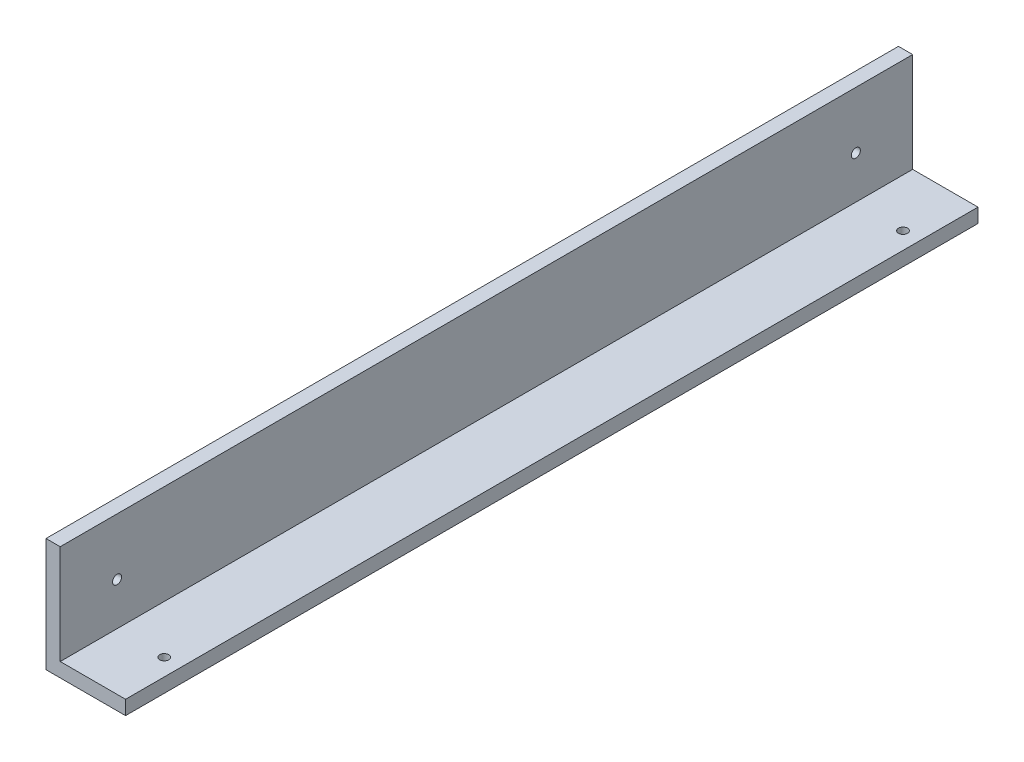
ISO-10303-21;
HEADER;
FILE_DESCRIPTION(('STEP AP214'),'2;1');
FILE_NAME('part.step','',(''),(''),'','','');
FILE_SCHEMA(('AUTOMOTIVE_DESIGN { 1 0 10303 214 1 1 1 1 }'));
ENDSEC;
DATA;
#1=APPLICATION_CONTEXT('core data for automotive mechanical design processes');
#2=APPLICATION_PROTOCOL_DEFINITION('international standard','automotive_design',2000,#1);
#3=PRODUCT_CONTEXT('',#1,'mechanical');
#4=PRODUCT('Part','Part','',(#3));
#5=PRODUCT_RELATED_PRODUCT_CATEGORY('part','',(#4));
#6=PRODUCT_DEFINITION_FORMATION('','',#4);
#7=PRODUCT_DEFINITION_CONTEXT('part definition',#1,'design');
#8=PRODUCT_DEFINITION('design','',#6,#7);
#9=PRODUCT_DEFINITION_SHAPE('','',#8);
#10=(LENGTH_UNIT() NAMED_UNIT(*) SI_UNIT(.MILLI.,.METRE.));
#11=(NAMED_UNIT(*) PLANE_ANGLE_UNIT() SI_UNIT($,.RADIAN.));
#12=(NAMED_UNIT(*) SI_UNIT($,.STERADIAN.) SOLID_ANGLE_UNIT());
#13=UNCERTAINTY_MEASURE_WITH_UNIT(LENGTH_MEASURE(1.E-05),#10,'distance_accuracy_value','');
#14=(GEOMETRIC_REPRESENTATION_CONTEXT(3) GLOBAL_UNCERTAINTY_ASSIGNED_CONTEXT((#13)) GLOBAL_UNIT_ASSIGNED_CONTEXT((#10,
#11,#12)) REPRESENTATION_CONTEXT('',''));
#15=CARTESIAN_POINT('',(0.,0.,0.));
#16=DIRECTION('',(0.,0.,1.));
#17=DIRECTION('',(1.,0.,0.));
#18=AXIS2_PLACEMENT_3D('',#15,#16,#17);
#19=CARTESIAN_POINT('',(0.,0.,381.));
#20=DIRECTION('',(0.,1.,0.));
#21=DIRECTION('',(0.,0.,1.));
#22=AXIS2_PLACEMENT_3D('',#19,#20,#21);
#23=PLANE('',#22);
#24=CARTESIAN_POINT('',(27.9399999999999,0.,356.095307591426));
#25=DIRECTION('',(0.,1.,0.));
#26=DIRECTION('',(0.,0.,1.));
#27=AXIS2_PLACEMENT_3D('',#24,#25,#26);
#28=CIRCLE('',#27,2.0193);
#29=CARTESIAN_POINT('',(27.9399999999999,0.,358.114607591426));
#30=VERTEX_POINT('',#29);
#31=EDGE_CURVE('E165',#30,#30,#28,.T.);
#32=ORIENTED_EDGE('',*,*,#31,.T.);
#33=EDGE_LOOP('',(#32));
#34=FACE_BOUND('',#33,.T.);
#35=CARTESIAN_POINT('',(27.94,0.,25.8953075914262));
#36=DIRECTION('',(0.,1.,0.));
#37=DIRECTION('',(0.,0.,1.));
#38=AXIS2_PLACEMENT_3D('',#35,#36,#37);
#39=CIRCLE('',#38,2.0193);
#40=CARTESIAN_POINT('',(27.94,0.,27.9146075914262));
#41=VERTEX_POINT('',#40);
#42=EDGE_CURVE('E168',#41,#41,#39,.T.);
#43=ORIENTED_EDGE('',*,*,#42,.T.);
#44=EDGE_LOOP('',(#43));
#45=FACE_BOUND('',#44,.T.);
#46=DIRECTION('',(1.,0.,0.));
#47=VECTOR('',#46,1.);
#48=CARTESIAN_POINT('',(0.,0.,0.));
#49=LINE('',#48,#47);
#50=CARTESIAN_POINT('',(0.,0.,0.));
#51=VERTEX_POINT('',#50);
#52=CARTESIAN_POINT('',(35.56,0.,0.));
#53=VERTEX_POINT('',#52);
#54=EDGE_CURVE('E119',#51,#53,#49,.T.);
#55=ORIENTED_EDGE('',*,*,#54,.T.);
#56=DIRECTION('',(0.,0.,-1.));
#57=VECTOR('',#56,1.);
#58=CARTESIAN_POINT('',(35.56,0.,381.));
#59=LINE('',#58,#57);
#60=CARTESIAN_POINT('',(35.56,0.,381.));
#61=VERTEX_POINT('',#60);
#62=EDGE_CURVE('E11',#61,#53,#59,.T.);
#63=ORIENTED_EDGE('',*,*,#62,.F.);
#64=DIRECTION('',(1.,0.,0.));
#65=VECTOR('',#64,1.);
#66=CARTESIAN_POINT('',(0.,0.,381.));
#67=LINE('',#66,#65);
#68=CARTESIAN_POINT('',(0.,0.,381.));
#69=VERTEX_POINT('',#68);
#70=EDGE_CURVE('E130',#69,#61,#67,.T.);
#71=ORIENTED_EDGE('',*,*,#70,.F.);
#72=DIRECTION('',(0.,0.,-1.));
#73=VECTOR('',#72,1.);
#74=CARTESIAN_POINT('',(0.,0.,381.));
#75=LINE('',#74,#73);
#76=EDGE_CURVE('E115',#69,#51,#75,.T.);
#77=ORIENTED_EDGE('',*,*,#76,.T.);
#78=EDGE_LOOP('',(#55,#63,#71,#77));
#79=FACE_BOUND('',#78,.T.);
#80=ADVANCED_FACE('F35',(#34,#45,#79),#23,.F.);
#81=CARTESIAN_POINT('',(35.56,0.,381.));
#82=DIRECTION('',(-1.,0.,0.));
#83=DIRECTION('',(0.,0.,1.));
#84=AXIS2_PLACEMENT_3D('',#81,#82,#83);
#85=PLANE('',#84);
#86=DIRECTION('',(0.,1.,0.));
#87=VECTOR('',#86,1.);
#88=CARTESIAN_POINT('',(35.56,0.,0.));
#89=LINE('',#88,#87);
#90=CARTESIAN_POINT('',(35.56,6.35,0.));
#91=VERTEX_POINT('',#90);
#92=EDGE_CURVE('E122',#53,#91,#89,.T.);
#93=ORIENTED_EDGE('',*,*,#92,.T.);
#94=DIRECTION('',(0.,0.,-1.));
#95=VECTOR('',#94,1.);
#96=CARTESIAN_POINT('',(35.56,6.35,381.));
#97=LINE('',#96,#95);
#98=CARTESIAN_POINT('',(35.56,6.35,381.));
#99=VERTEX_POINT('',#98);
#100=EDGE_CURVE('E43',#99,#91,#97,.T.);
#101=ORIENTED_EDGE('',*,*,#100,.F.);
#102=DIRECTION('',(0.,1.,0.));
#103=VECTOR('',#102,1.);
#104=CARTESIAN_POINT('',(35.56,0.,381.));
#105=LINE('',#104,#103);
#106=EDGE_CURVE('E88',#61,#99,#105,.T.);
#107=ORIENTED_EDGE('',*,*,#106,.F.);
#108=ORIENTED_EDGE('',*,*,#62,.T.);
#109=EDGE_LOOP('',(#93,#101,#107,#108));
#110=FACE_BOUND('',#109,.T.);
#111=ADVANCED_FACE('F157',(#110),#85,.F.);
#112=CARTESIAN_POINT('',(6.35,6.35,381.));
#113=DIRECTION('',(0.,-1.,0.));
#114=DIRECTION('',(0.,0.,-1.));
#115=AXIS2_PLACEMENT_3D('',#112,#113,#114);
#116=PLANE('',#115);
#117=CARTESIAN_POINT('',(27.9399999999999,6.35,356.095307591426));
#118=DIRECTION('',(0.,1.,0.));
#119=DIRECTION('',(0.,0.,1.));
#120=AXIS2_PLACEMENT_3D('',#117,#118,#119);
#121=CIRCLE('',#120,2.01929999999999);
#122=CARTESIAN_POINT('',(27.9399999999999,6.35,358.114607591426));
#123=VERTEX_POINT('',#122);
#124=EDGE_CURVE('E295',#123,#123,#121,.T.);
#125=ORIENTED_EDGE('',*,*,#124,.F.);
#126=EDGE_LOOP('',(#125));
#127=FACE_BOUND('',#126,.T.);
#128=CARTESIAN_POINT('',(27.94,6.35,25.8953075914262));
#129=DIRECTION('',(0.,1.,0.));
#130=DIRECTION('',(0.,0.,1.));
#131=AXIS2_PLACEMENT_3D('',#128,#129,#130);
#132=CIRCLE('',#131,2.01929999999999);
#133=CARTESIAN_POINT('',(27.94,6.35,27.9146075914262));
#134=VERTEX_POINT('',#133);
#135=EDGE_CURVE('E171',#134,#134,#132,.T.);
#136=ORIENTED_EDGE('',*,*,#135,.F.);
#137=EDGE_LOOP('',(#136));
#138=FACE_BOUND('',#137,.T.);
#139=DIRECTION('',(-1.,0.,0.));
#140=VECTOR('',#139,1.);
#141=CARTESIAN_POINT('',(6.35,6.35,0.));
#142=LINE('',#141,#140);
#143=CARTESIAN_POINT('',(6.35,6.35,0.));
#144=VERTEX_POINT('',#143);
#145=EDGE_CURVE('E125',#91,#144,#142,.T.);
#146=ORIENTED_EDGE('',*,*,#145,.T.);
#147=DIRECTION('',(0.,0.,-1.));
#148=VECTOR('',#147,1.);
#149=CARTESIAN_POINT('',(6.35,6.35,381.));
#150=LINE('',#149,#148);
#151=CARTESIAN_POINT('',(6.35,6.35,381.));
#152=VERTEX_POINT('',#151);
#153=EDGE_CURVE('E110',#152,#144,#150,.T.);
#154=ORIENTED_EDGE('',*,*,#153,.F.);
#155=DIRECTION('',(-1.,0.,0.));
#156=VECTOR('',#155,1.);
#157=CARTESIAN_POINT('',(6.35,6.35,381.));
#158=LINE('',#157,#156);
#159=EDGE_CURVE('E101',#99,#152,#158,.T.);
#160=ORIENTED_EDGE('',*,*,#159,.F.);
#161=ORIENTED_EDGE('',*,*,#100,.T.);
#162=EDGE_LOOP('',(#146,#154,#160,#161));
#163=FACE_BOUND('',#162,.T.);
#164=ADVANCED_FACE('F136',(#127,#138,#163),#116,.F.);
#165=CARTESIAN_POINT('',(6.35,50.8,381.));
#166=DIRECTION('',(-1.,0.,0.));
#167=DIRECTION('',(0.,0.,1.));
#168=AXIS2_PLACEMENT_3D('',#165,#166,#167);
#169=PLANE('',#168);
#170=CARTESIAN_POINT('',(6.35,25.399999999999,355.600000000001));
#171=DIRECTION('',(1.,0.,0.));
#172=DIRECTION('',(0.,0.,-1.));
#173=AXIS2_PLACEMENT_3D('',#170,#171,#172);
#174=CIRCLE('',#173,2.01929999999999);
#175=CARTESIAN_POINT('',(6.35,25.399999999999,353.580700000001));
#176=VERTEX_POINT('',#175);
#177=EDGE_CURVE('E170',#176,#176,#174,.T.);
#178=ORIENTED_EDGE('',*,*,#177,.F.);
#179=EDGE_LOOP('',(#178));
#180=FACE_BOUND('',#179,.T.);
#181=CARTESIAN_POINT('',(6.35,25.4000000000003,25.4000000000004));
#182=DIRECTION('',(1.,0.,0.));
#183=DIRECTION('',(0.,0.,-1.));
#184=AXIS2_PLACEMENT_3D('',#181,#182,#183);
#185=CIRCLE('',#184,2.01929999999999);
#186=CARTESIAN_POINT('',(6.35,25.4000000000003,23.3807000000004));
#187=VERTEX_POINT('',#186);
#188=EDGE_CURVE('E181',#187,#187,#185,.T.);
#189=ORIENTED_EDGE('',*,*,#188,.F.);
#190=EDGE_LOOP('',(#189));
#191=FACE_BOUND('',#190,.T.);
#192=DIRECTION('',(0.,1.,0.));
#193=VECTOR('',#192,1.);
#194=CARTESIAN_POINT('',(6.35,50.8,0.));
#195=LINE('',#194,#193);
#196=CARTESIAN_POINT('',(6.35,50.8,0.));
#197=VERTEX_POINT('',#196);
#198=EDGE_CURVE('E109',#144,#197,#195,.T.);
#199=ORIENTED_EDGE('',*,*,#198,.T.);
#200=DIRECTION('',(0.,0.,-1.));
#201=VECTOR('',#200,1.);
#202=CARTESIAN_POINT('',(6.35,50.8,381.));
#203=LINE('',#202,#201);
#204=CARTESIAN_POINT('',(6.35,50.8,381.));
#205=VERTEX_POINT('',#204);
#206=EDGE_CURVE('E106',#205,#197,#203,.T.);
#207=ORIENTED_EDGE('',*,*,#206,.F.);
#208=DIRECTION('',(0.,1.,0.));
#209=VECTOR('',#208,1.);
#210=CARTESIAN_POINT('',(6.35,50.8,381.));
#211=LINE('',#210,#209);
#212=EDGE_CURVE('E95',#152,#205,#211,.T.);
#213=ORIENTED_EDGE('',*,*,#212,.F.);
#214=ORIENTED_EDGE('',*,*,#153,.T.);
#215=EDGE_LOOP('',(#199,#207,#213,#214));
#216=FACE_BOUND('',#215,.T.);
#217=ADVANCED_FACE('F107',(#180,#191,#216),#169,.F.);
#218=CARTESIAN_POINT('',(0.,50.8,381.));
#219=DIRECTION('',(0.,-1.,0.));
#220=DIRECTION('',(0.,0.,-1.));
#221=AXIS2_PLACEMENT_3D('',#218,#219,#220);
#222=PLANE('',#221);
#223=DIRECTION('',(-1.,0.,0.));
#224=VECTOR('',#223,1.);
#225=CARTESIAN_POINT('',(0.,50.8,0.));
#226=LINE('',#225,#224);
#227=CARTESIAN_POINT('',(0.,50.8,0.));
#228=VERTEX_POINT('',#227);
#229=EDGE_CURVE('E74',#197,#228,#226,.T.);
#230=ORIENTED_EDGE('',*,*,#229,.T.);
#231=DIRECTION('',(0.,0.,-1.));
#232=VECTOR('',#231,1.);
#233=CARTESIAN_POINT('',(0.,50.8,381.));
#234=LINE('',#233,#232);
#235=CARTESIAN_POINT('',(0.,50.8,381.));
#236=VERTEX_POINT('',#235);
#237=EDGE_CURVE('E111',#236,#228,#234,.T.);
#238=ORIENTED_EDGE('',*,*,#237,.F.);
#239=DIRECTION('',(-1.,0.,0.));
#240=VECTOR('',#239,1.);
#241=CARTESIAN_POINT('',(0.,50.8,381.));
#242=LINE('',#241,#240);
#243=EDGE_CURVE('E99',#205,#236,#242,.T.);
#244=ORIENTED_EDGE('',*,*,#243,.F.);
#245=ORIENTED_EDGE('',*,*,#206,.T.);
#246=EDGE_LOOP('',(#230,#238,#244,#245));
#247=FACE_BOUND('',#246,.T.);
#248=ADVANCED_FACE('F113',(#247),#222,.F.);
#249=CARTESIAN_POINT('',(0.,0.,381.));
#250=DIRECTION('',(1.,0.,0.));
#251=DIRECTION('',(0.,0.,-1.));
#252=AXIS2_PLACEMENT_3D('',#249,#250,#251);
#253=PLANE('',#252);
#254=CARTESIAN_POINT('',(0.,25.399999999999,355.600000000001));
#255=DIRECTION('',(1.,0.,0.));
#256=DIRECTION('',(0.,0.,-1.));
#257=AXIS2_PLACEMENT_3D('',#254,#255,#256);
#258=CIRCLE('',#257,2.0193);
#259=CARTESIAN_POINT('',(0.,25.399999999999,353.580700000001));
#260=VERTEX_POINT('',#259);
#261=EDGE_CURVE('E174',#260,#260,#258,.T.);
#262=ORIENTED_EDGE('',*,*,#261,.T.);
#263=EDGE_LOOP('',(#262));
#264=FACE_BOUND('',#263,.T.);
#265=CARTESIAN_POINT('',(0.,25.4000000000003,25.4000000000004));
#266=DIRECTION('',(1.,0.,0.));
#267=DIRECTION('',(0.,0.,-1.));
#268=AXIS2_PLACEMENT_3D('',#265,#266,#267);
#269=CIRCLE('',#268,2.0193);
#270=CARTESIAN_POINT('',(0.,25.4000000000003,23.3807000000004));
#271=VERTEX_POINT('',#270);
#272=EDGE_CURVE('E123',#271,#271,#269,.T.);
#273=ORIENTED_EDGE('',*,*,#272,.T.);
#274=EDGE_LOOP('',(#273));
#275=FACE_BOUND('',#274,.T.);
#276=DIRECTION('',(0.,-1.,0.));
#277=VECTOR('',#276,1.);
#278=CARTESIAN_POINT('',(0.,0.,0.));
#279=LINE('',#278,#277);
#280=EDGE_CURVE('E80',#228,#51,#279,.T.);
#281=ORIENTED_EDGE('',*,*,#280,.T.);
#282=ORIENTED_EDGE('',*,*,#76,.F.);
#283=DIRECTION('',(0.,-1.,0.));
#284=VECTOR('',#283,1.);
#285=CARTESIAN_POINT('',(0.,0.,381.));
#286=LINE('',#285,#284);
#287=EDGE_CURVE('E51',#236,#69,#286,.T.);
#288=ORIENTED_EDGE('',*,*,#287,.F.);
#289=ORIENTED_EDGE('',*,*,#237,.T.);
#290=EDGE_LOOP('',(#281,#282,#288,#289));
#291=FACE_BOUND('',#290,.T.);
#292=ADVANCED_FACE('F143',(#264,#275,#291),#253,.F.);
#293=CARTESIAN_POINT('',(35.56,0.,381.));
#294=DIRECTION('',(0.,0.,1.));
#295=DIRECTION('',(1.,0.,0.));
#296=AXIS2_PLACEMENT_3D('',#293,#294,#295);
#297=PLANE('',#296);
#298=ORIENTED_EDGE('',*,*,#70,.T.);
#299=ORIENTED_EDGE('',*,*,#106,.T.);
#300=ORIENTED_EDGE('',*,*,#159,.T.);
#301=ORIENTED_EDGE('',*,*,#212,.T.);
#302=ORIENTED_EDGE('',*,*,#243,.T.);
#303=ORIENTED_EDGE('',*,*,#287,.T.);
#304=EDGE_LOOP('',(#298,#299,#300,#301,#302,#303));
#305=FACE_BOUND('',#304,.T.);
#306=ADVANCED_FACE('F97',(#305),#297,.T.);
#307=CARTESIAN_POINT('',(35.56,0.,0.));
#308=DIRECTION('',(0.,0.,1.));
#309=DIRECTION('',(1.,0.,0.));
#310=AXIS2_PLACEMENT_3D('',#307,#308,#309);
#311=PLANE('',#310);
#312=ORIENTED_EDGE('',*,*,#54,.F.);
#313=ORIENTED_EDGE('',*,*,#280,.F.);
#314=ORIENTED_EDGE('',*,*,#229,.F.);
#315=ORIENTED_EDGE('',*,*,#198,.F.);
#316=ORIENTED_EDGE('',*,*,#145,.F.);
#317=ORIENTED_EDGE('',*,*,#92,.F.);
#318=EDGE_LOOP('',(#312,#313,#314,#315,#316,#317));
#319=FACE_BOUND('',#318,.T.);
#320=ADVANCED_FACE('F139',(#319),#311,.F.);
#321=CARTESIAN_POINT('',(6.35,25.4000000000003,25.4000000000004));
#322=DIRECTION('',(1.,0.,0.));
#323=DIRECTION('',(0.,0.,-1.));
#324=AXIS2_PLACEMENT_3D('',#321,#322,#323);
#325=CYLINDRICAL_SURFACE('',#324,2.01929999999999);
#326=ORIENTED_EDGE('',*,*,#272,.F.);
#327=EDGE_LOOP('',(#326));
#328=FACE_BOUND('',#327,.T.);
#329=ORIENTED_EDGE('',*,*,#188,.T.);
#330=EDGE_LOOP('',(#329));
#331=FACE_BOUND('',#330,.T.);
#332=ADVANCED_FACE('F189',(#328,#331),#325,.F.);
#333=CARTESIAN_POINT('',(6.35,25.399999999999,355.600000000001));
#334=DIRECTION('',(1.,0.,0.));
#335=DIRECTION('',(0.,0.,-1.));
#336=AXIS2_PLACEMENT_3D('',#333,#334,#335);
#337=CYLINDRICAL_SURFACE('',#336,2.01929999999999);
#338=ORIENTED_EDGE('',*,*,#261,.F.);
#339=EDGE_LOOP('',(#338));
#340=FACE_BOUND('',#339,.T.);
#341=ORIENTED_EDGE('',*,*,#177,.T.);
#342=EDGE_LOOP('',(#341));
#343=FACE_BOUND('',#342,.T.);
#344=ADVANCED_FACE('F192',(#340,#343),#337,.F.);
#345=CARTESIAN_POINT('',(27.94,6.35,25.8953075914262));
#346=DIRECTION('',(0.,1.,0.));
#347=DIRECTION('',(0.,0.,1.));
#348=AXIS2_PLACEMENT_3D('',#345,#346,#347);
#349=CYLINDRICAL_SURFACE('',#348,2.01929999999999);
#350=ORIENTED_EDGE('',*,*,#42,.F.);
#351=EDGE_LOOP('',(#350));
#352=FACE_BOUND('',#351,.T.);
#353=ORIENTED_EDGE('',*,*,#135,.T.);
#354=EDGE_LOOP('',(#353));
#355=FACE_BOUND('',#354,.T.);
#356=ADVANCED_FACE('F207',(#352,#355),#349,.F.);
#357=CARTESIAN_POINT('',(27.9399999999999,6.35,356.095307591426));
#358=DIRECTION('',(0.,1.,0.));
#359=DIRECTION('',(0.,0.,1.));
#360=AXIS2_PLACEMENT_3D('',#357,#358,#359);
#361=CYLINDRICAL_SURFACE('',#360,2.01929999999999);
#362=ORIENTED_EDGE('',*,*,#31,.F.);
#363=EDGE_LOOP('',(#362));
#364=FACE_BOUND('',#363,.T.);
#365=ORIENTED_EDGE('',*,*,#124,.T.);
#366=EDGE_LOOP('',(#365));
#367=FACE_BOUND('',#366,.T.);
#368=ADVANCED_FACE('F213',(#364,#367),#361,.F.);
#369=CLOSED_SHELL('',(#80,#111,#164,#217,#248,#292,#306,#320,#332,#344,#356,#368));
#370=MANIFOLD_SOLID_BREP('B2',#369);
#371=ADVANCED_BREP_SHAPE_REPRESENTATION('',(#18,#370),#14);
#372=SHAPE_DEFINITION_REPRESENTATION(#9,#371);
ENDSEC;
END-ISO-10303-21;
